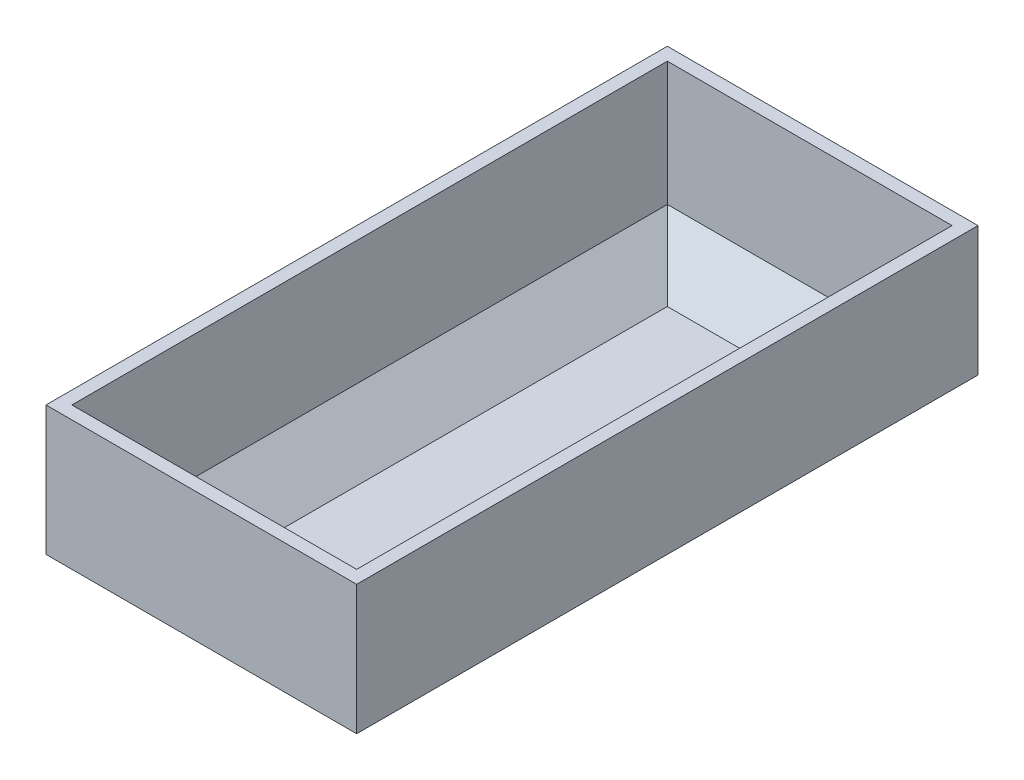
ISO-10303-21;
HEADER;
FILE_DESCRIPTION(('STEP AP214'),'2;1');
FILE_NAME('part.step','',(''),(''),'','','');
FILE_SCHEMA(('AUTOMOTIVE_DESIGN { 1 0 10303 214 1 1 1 1 }'));
ENDSEC;
DATA;
#1=APPLICATION_CONTEXT('core data for automotive mechanical design processes');
#2=APPLICATION_PROTOCOL_DEFINITION('international standard','automotive_design',2000,#1);
#3=PRODUCT_CONTEXT('',#1,'mechanical');
#4=PRODUCT('Part','Part','',(#3));
#5=PRODUCT_RELATED_PRODUCT_CATEGORY('part','',(#4));
#6=PRODUCT_DEFINITION_FORMATION('','',#4);
#7=PRODUCT_DEFINITION_CONTEXT('part definition',#1,'design');
#8=PRODUCT_DEFINITION('design','',#6,#7);
#9=PRODUCT_DEFINITION_SHAPE('','',#8);
#10=(LENGTH_UNIT() NAMED_UNIT(*) SI_UNIT(.MILLI.,.METRE.));
#11=(NAMED_UNIT(*) PLANE_ANGLE_UNIT() SI_UNIT($,.RADIAN.));
#12=(NAMED_UNIT(*) SI_UNIT($,.STERADIAN.) SOLID_ANGLE_UNIT());
#13=UNCERTAINTY_MEASURE_WITH_UNIT(LENGTH_MEASURE(1.E-05),#10,'distance_accuracy_value','');
#14=(GEOMETRIC_REPRESENTATION_CONTEXT(3) GLOBAL_UNCERTAINTY_ASSIGNED_CONTEXT((#13)) GLOBAL_UNIT_ASSIGNED_CONTEXT((#10,
#11,#12)) REPRESENTATION_CONTEXT('',''));
#15=CARTESIAN_POINT('',(0.,0.,0.));
#16=DIRECTION('',(0.,0.,1.));
#17=DIRECTION('',(1.,0.,0.));
#18=AXIS2_PLACEMENT_3D('',#15,#16,#17);
#19=CARTESIAN_POINT('',(-152.4,177.8,304.8));
#20=DIRECTION('',(0.,-1.,0.));
#21=DIRECTION('',(0.,0.,-1.));
#22=AXIS2_PLACEMENT_3D('',#19,#20,#21);
#23=PLANE('',#22);
#24=DIRECTION('',(-1.,0.,0.));
#25=VECTOR('',#24,1.);
#26=CARTESIAN_POINT('',(-152.4,177.8,-304.8));
#27=LINE('',#26,#25);
#28=CARTESIAN_POINT('',(152.4,177.8,-304.8));
#29=VERTEX_POINT('',#28);
#30=CARTESIAN_POINT('',(-152.4,177.8,-304.8));
#31=VERTEX_POINT('',#30);
#32=EDGE_CURVE('E261',#29,#31,#27,.T.);
#33=ORIENTED_EDGE('',*,*,#32,.T.);
#34=DIRECTION('',(0.,0.,-1.));
#35=VECTOR('',#34,1.);
#36=CARTESIAN_POINT('',(-152.4,177.8,304.8));
#37=LINE('',#36,#35);
#38=CARTESIAN_POINT('',(-152.4,177.8,304.8));
#39=VERTEX_POINT('',#38);
#40=EDGE_CURVE('E270',#39,#31,#37,.T.);
#41=ORIENTED_EDGE('',*,*,#40,.F.);
#42=DIRECTION('',(-1.,0.,0.));
#43=VECTOR('',#42,1.);
#44=CARTESIAN_POINT('',(-152.4,177.8,304.8));
#45=LINE('',#44,#43);
#46=CARTESIAN_POINT('',(152.4,177.8,304.8));
#47=VERTEX_POINT('',#46);
#48=EDGE_CURVE('E63',#47,#39,#45,.T.);
#49=ORIENTED_EDGE('',*,*,#48,.F.);
#50=DIRECTION('',(0.,0.,-1.));
#51=VECTOR('',#50,1.);
#52=CARTESIAN_POINT('',(152.4,177.8,304.8));
#53=LINE('',#52,#51);
#54=EDGE_CURVE('E274',#47,#29,#53,.T.);
#55=ORIENTED_EDGE('',*,*,#54,.T.);
#56=EDGE_LOOP('',(#33,#41,#49,#55));
#57=FACE_BOUND('',#56,.T.);
#58=DIRECTION('',(-1.,0.,0.));
#59=VECTOR('',#58,1.);
#60=CARTESIAN_POINT('',(-152.4,177.8,-292.1));
#61=LINE('',#60,#59);
#62=CARTESIAN_POINT('',(139.7,177.8,-292.1));
#63=VERTEX_POINT('',#62);
#64=CARTESIAN_POINT('',(-139.7,177.8,-292.1));
#65=VERTEX_POINT('',#64);
#66=EDGE_CURVE('E166',#63,#65,#61,.T.);
#67=ORIENTED_EDGE('',*,*,#66,.F.);
#68=DIRECTION('',(0.,0.,-1.));
#69=VECTOR('',#68,1.);
#70=CARTESIAN_POINT('',(139.7,177.8,304.8));
#71=LINE('',#70,#69);
#72=CARTESIAN_POINT('',(139.7,177.8,292.1));
#73=VERTEX_POINT('',#72);
#74=EDGE_CURVE('E180',#73,#63,#71,.T.);
#75=ORIENTED_EDGE('',*,*,#74,.F.);
#76=DIRECTION('',(-1.,0.,0.));
#77=VECTOR('',#76,1.);
#78=CARTESIAN_POINT('',(-152.4,177.8,292.1));
#79=LINE('',#78,#77);
#80=CARTESIAN_POINT('',(-139.7,177.8,292.1));
#81=VERTEX_POINT('',#80);
#82=EDGE_CURVE('E54',#73,#81,#79,.T.);
#83=ORIENTED_EDGE('',*,*,#82,.T.);
#84=DIRECTION('',(0.,0.,-1.));
#85=VECTOR('',#84,1.);
#86=CARTESIAN_POINT('',(-139.7,177.8,304.8));
#87=LINE('',#86,#85);
#88=EDGE_CURVE('E176',#81,#65,#87,.T.);
#89=ORIENTED_EDGE('',*,*,#88,.T.);
#90=EDGE_LOOP('',(#67,#75,#83,#89));
#91=FACE_BOUND('',#90,.T.);
#92=ADVANCED_FACE('F38',(#57,#91),#23,.F.);
#93=CARTESIAN_POINT('',(-101.6,0.,304.8));
#94=DIRECTION('',(0.707106781186547,0.707106781186548,0.));
#95=DIRECTION('',(-0.707106781186548,0.707106781186547,0.));
#96=AXIS2_PLACEMENT_3D('',#93,#94,#95);
#97=PLANE('',#96);
#98=DIRECTION('',(0.,0.,-1.));
#99=VECTOR('',#98,1.);
#100=CARTESIAN_POINT('',(-152.4,50.8,304.8));
#101=LINE('',#100,#99);
#102=CARTESIAN_POINT('',(-152.4,50.8,304.8));
#103=VERTEX_POINT('',#102);
#104=CARTESIAN_POINT('',(-152.4,50.8,-304.8));
#105=VERTEX_POINT('',#104);
#106=EDGE_CURVE('E258',#103,#105,#101,.T.);
#107=ORIENTED_EDGE('',*,*,#106,.T.);
#108=DIRECTION('',(0.577350269189625,-0.577350269189625,0.577350269189628));
#109=VECTOR('',#108,1.);
#110=CARTESIAN_POINT('',(84.6666666666669,-186.266666666667,-67.733333333332));
#111=LINE('',#110,#109);
#112=CARTESIAN_POINT('',(-101.6,0.,-254.));
#113=VERTEX_POINT('',#112);
#114=EDGE_CURVE('E81',#105,#113,#111,.T.);
#115=ORIENTED_EDGE('',*,*,#114,.T.);
#116=DIRECTION('',(0.,0.,-1.));
#117=VECTOR('',#116,1.);
#118=CARTESIAN_POINT('',(-101.6,0.,304.8));
#119=LINE('',#118,#117);
#120=CARTESIAN_POINT('',(-101.6,0.,254.));
#121=VERTEX_POINT('',#120);
#122=EDGE_CURVE('E11',#121,#113,#119,.T.);
#123=ORIENTED_EDGE('',*,*,#122,.F.);
#124=DIRECTION('',(-0.577350269189625,0.577350269189625,0.577350269189628));
#125=VECTOR('',#124,1.);
#126=CARTESIAN_POINT('',(-118.533333333333,16.9333333333334,270.933333333333));
#127=LINE('',#126,#125);
#128=EDGE_CURVE('E244',#121,#103,#127,.T.);
#129=ORIENTED_EDGE('',*,*,#128,.T.);
#130=EDGE_LOOP('',(#107,#115,#123,#129));
#131=FACE_BOUND('',#130,.T.);
#132=ADVANCED_FACE('F40',(#131),#97,.F.);
#133=CARTESIAN_POINT('',(-101.6,0.,304.8));
#134=DIRECTION('',(0.,1.,0.));
#135=DIRECTION('',(-1.,0.,0.));
#136=AXIS2_PLACEMENT_3D('',#133,#134,#135);
#137=PLANE('',#136);
#138=ORIENTED_EDGE('',*,*,#122,.T.);
#139=DIRECTION('',(1.,0.,0.));
#140=VECTOR('',#139,1.);
#141=CARTESIAN_POINT('',(-152.4,0.,-254.));
#142=LINE('',#141,#140);
#143=CARTESIAN_POINT('',(101.6,0.,-254.));
#144=VERTEX_POINT('',#143);
#145=EDGE_CURVE('E228',#113,#144,#142,.T.);
#146=ORIENTED_EDGE('',*,*,#145,.T.);
#147=DIRECTION('',(0.,0.,-1.));
#148=VECTOR('',#147,1.);
#149=CARTESIAN_POINT('',(101.6,0.,304.8));
#150=LINE('',#149,#148);
#151=CARTESIAN_POINT('',(101.6,0.,254.));
#152=VERTEX_POINT('',#151);
#153=EDGE_CURVE('E47',#152,#144,#150,.T.);
#154=ORIENTED_EDGE('',*,*,#153,.F.);
#155=DIRECTION('',(1.,0.,0.));
#156=VECTOR('',#155,1.);
#157=CARTESIAN_POINT('',(-152.4,0.,254.));
#158=LINE('',#157,#156);
#159=EDGE_CURVE('E232',#121,#152,#158,.T.);
#160=ORIENTED_EDGE('',*,*,#159,.F.);
#161=EDGE_LOOP('',(#138,#146,#154,#160));
#162=FACE_BOUND('',#161,.T.);
#163=ADVANCED_FACE('F289',(#162),#137,.F.);
#164=CARTESIAN_POINT('',(152.4,50.8,304.8));
#165=DIRECTION('',(-0.707106781186547,0.707106781186548,0.));
#166=DIRECTION('',(-0.707106781186548,-0.707106781186547,0.));
#167=AXIS2_PLACEMENT_3D('',#164,#165,#166);
#168=PLANE('',#167);
#169=ORIENTED_EDGE('',*,*,#153,.T.);
#170=DIRECTION('',(0.577350269189625,0.577350269189625,-0.577350269189628));
#171=VECTOR('',#170,1.);
#172=CARTESIAN_POINT('',(-50.8000000000003,-152.4,-101.599999999999));
#173=LINE('',#172,#171);
#174=CARTESIAN_POINT('',(152.4,50.8,-304.8));
#175=VERTEX_POINT('',#174);
#176=EDGE_CURVE('E227',#144,#175,#173,.T.);
#177=ORIENTED_EDGE('',*,*,#176,.T.);
#178=DIRECTION('',(0.,0.,-1.));
#179=VECTOR('',#178,1.);
#180=CARTESIAN_POINT('',(152.4,50.8,304.8));
#181=LINE('',#180,#179);
#182=CARTESIAN_POINT('',(152.4,50.8,304.8));
#183=VERTEX_POINT('',#182);
#184=EDGE_CURVE('E278',#183,#175,#181,.T.);
#185=ORIENTED_EDGE('',*,*,#184,.F.);
#186=DIRECTION('',(-0.577350269189625,-0.577350269189625,-0.577350269189628));
#187=VECTOR('',#186,1.);
#188=CARTESIAN_POINT('',(152.4,50.8,304.8));
#189=LINE('',#188,#187);
#190=EDGE_CURVE('E88',#183,#152,#189,.T.);
#191=ORIENTED_EDGE('',*,*,#190,.T.);
#192=EDGE_LOOP('',(#169,#177,#185,#191));
#193=FACE_BOUND('',#192,.T.);
#194=ADVANCED_FACE('F285',(#193),#168,.F.);
#195=CARTESIAN_POINT('',(152.4,177.8,304.8));
#196=DIRECTION('',(-1.,0.,0.));
#197=DIRECTION('',(0.,0.,1.));
#198=AXIS2_PLACEMENT_3D('',#195,#196,#197);
#199=PLANE('',#198);
#200=DIRECTION('',(0.,1.,0.));
#201=VECTOR('',#200,1.);
#202=CARTESIAN_POINT('',(152.4,177.8,-304.8));
#203=LINE('',#202,#201);
#204=EDGE_CURVE('E248',#175,#29,#203,.T.);
#205=ORIENTED_EDGE('',*,*,#204,.T.);
#206=ORIENTED_EDGE('',*,*,#54,.F.);
#207=DIRECTION('',(0.,1.,0.));
#208=VECTOR('',#207,1.);
#209=CARTESIAN_POINT('',(152.4,177.8,304.8));
#210=LINE('',#209,#208);
#211=EDGE_CURVE('E249',#183,#47,#210,.T.);
#212=ORIENTED_EDGE('',*,*,#211,.F.);
#213=ORIENTED_EDGE('',*,*,#184,.T.);
#214=EDGE_LOOP('',(#205,#206,#212,#213));
#215=FACE_BOUND('',#214,.T.);
#216=ADVANCED_FACE('F304',(#215),#199,.F.);
#217=CARTESIAN_POINT('',(-152.4,50.8,304.8));
#218=DIRECTION('',(1.,0.,0.));
#219=DIRECTION('',(0.,0.,-1.));
#220=AXIS2_PLACEMENT_3D('',#217,#218,#219);
#221=PLANE('',#220);
#222=DIRECTION('',(0.,-1.,0.));
#223=VECTOR('',#222,1.);
#224=CARTESIAN_POINT('',(-152.4,50.8,-304.8));
#225=LINE('',#224,#223);
#226=EDGE_CURVE('E252',#31,#105,#225,.T.);
#227=ORIENTED_EDGE('',*,*,#226,.T.);
#228=ORIENTED_EDGE('',*,*,#106,.F.);
#229=DIRECTION('',(0.,-1.,0.));
#230=VECTOR('',#229,1.);
#231=CARTESIAN_POINT('',(-152.4,50.8,304.8));
#232=LINE('',#231,#230);
#233=EDGE_CURVE('E255',#39,#103,#232,.T.);
#234=ORIENTED_EDGE('',*,*,#233,.F.);
#235=ORIENTED_EDGE('',*,*,#40,.T.);
#236=EDGE_LOOP('',(#227,#228,#234,#235));
#237=FACE_BOUND('',#236,.T.);
#238=ADVANCED_FACE('F296',(#237),#221,.F.);
#239=CARTESIAN_POINT('',(0.,0.,304.8));
#240=DIRECTION('',(0.,0.,1.));
#241=DIRECTION('',(1.,0.,0.));
#242=AXIS2_PLACEMENT_3D('',#239,#240,#241);
#243=PLANE('',#242);
#244=DIRECTION('',(1.,0.,0.));
#245=VECTOR('',#244,1.);
#246=CARTESIAN_POINT('',(-152.4,50.8,304.8));
#247=LINE('',#246,#245);
#248=EDGE_CURVE('E186',#103,#183,#247,.T.);
#249=ORIENTED_EDGE('',*,*,#248,.T.);
#250=ORIENTED_EDGE('',*,*,#211,.T.);
#251=ORIENTED_EDGE('',*,*,#48,.T.);
#252=ORIENTED_EDGE('',*,*,#233,.T.);
#253=EDGE_LOOP('',(#249,#250,#251,#252));
#254=FACE_BOUND('',#253,.T.);
#255=ADVANCED_FACE('F347',(#254),#243,.T.);
#256=CARTESIAN_POINT('',(0.,0.,-304.8));
#257=DIRECTION('',(0.,0.,1.));
#258=DIRECTION('',(1.,0.,0.));
#259=AXIS2_PLACEMENT_3D('',#256,#257,#258);
#260=PLANE('',#259);
#261=ORIENTED_EDGE('',*,*,#204,.F.);
#262=DIRECTION('',(1.,0.,0.));
#263=VECTOR('',#262,1.);
#264=CARTESIAN_POINT('',(-152.4,50.8,-304.8));
#265=LINE('',#264,#263);
#266=EDGE_CURVE('E224',#105,#175,#265,.T.);
#267=ORIENTED_EDGE('',*,*,#266,.F.);
#268=ORIENTED_EDGE('',*,*,#226,.F.);
#269=ORIENTED_EDGE('',*,*,#32,.F.);
#270=EDGE_LOOP('',(#261,#267,#268,#269));
#271=FACE_BOUND('',#270,.T.);
#272=ADVANCED_FACE('F301',(#271),#260,.F.);
#273=CARTESIAN_POINT('',(-152.4,0.,-254.));
#274=DIRECTION('',(0.,0.707106781186549,0.707106781186546));
#275=DIRECTION('',(0.,-0.707106781186546,0.707106781186549));
#276=AXIS2_PLACEMENT_3D('',#273,#274,#275);
#277=PLANE('',#276);
#278=ORIENTED_EDGE('',*,*,#266,.T.);
#279=ORIENTED_EDGE('',*,*,#176,.F.);
#280=ORIENTED_EDGE('',*,*,#145,.F.);
#281=ORIENTED_EDGE('',*,*,#114,.F.);
#282=EDGE_LOOP('',(#278,#279,#280,#281));
#283=FACE_BOUND('',#282,.T.);
#284=ADVANCED_FACE('F291',(#283),#277,.F.);
#285=CARTESIAN_POINT('',(-152.4,50.8,304.8));
#286=DIRECTION('',(0.,0.707106781186549,-0.707106781186546));
#287=DIRECTION('',(0.,0.707106781186546,0.707106781186549));
#288=AXIS2_PLACEMENT_3D('',#285,#286,#287);
#289=PLANE('',#288);
#290=ORIENTED_EDGE('',*,*,#159,.T.);
#291=ORIENTED_EDGE('',*,*,#190,.F.);
#292=ORIENTED_EDGE('',*,*,#248,.F.);
#293=ORIENTED_EDGE('',*,*,#128,.F.);
#294=EDGE_LOOP('',(#290,#291,#292,#293));
#295=FACE_BOUND('',#294,.T.);
#296=ADVANCED_FACE('F344',(#295),#289,.F.);
#297=CARTESIAN_POINT('',(-92.6197438789308,8.98025612106916,304.8));
#298=DIRECTION('',(0.707106781186547,0.707106781186548,0.));
#299=DIRECTION('',(-0.707106781186548,0.707106781186547,0.));
#300=AXIS2_PLACEMENT_3D('',#297,#298,#299);
#301=PLANE('',#300);
#302=DIRECTION('',(0.,0.,-1.));
#303=VECTOR('',#302,1.);
#304=CARTESIAN_POINT('',(-139.7,56.0605122421383,304.8));
#305=LINE('',#304,#303);
#306=CARTESIAN_POINT('',(-139.7,56.0605122421383,292.1));
#307=VERTEX_POINT('',#306);
#308=CARTESIAN_POINT('',(-139.7,56.0605122421383,-292.1));
#309=VERTEX_POINT('',#308);
#310=EDGE_CURVE('E144',#307,#309,#305,.T.);
#311=ORIENTED_EDGE('',*,*,#310,.F.);
#312=DIRECTION('',(-0.577350269189625,0.577350269189625,0.577350269189628));
#313=VECTOR('',#312,1.);
#314=CARTESIAN_POINT('',(-112.546495919287,28.9070081614256,264.946495919287));
#315=LINE('',#314,#313);
#316=CARTESIAN_POINT('',(-96.3394877578617,12.7,248.739487757861));
#317=VERTEX_POINT('',#316);
#318=EDGE_CURVE('E188',#317,#307,#315,.T.);
#319=ORIENTED_EDGE('',*,*,#318,.F.);
#320=DIRECTION('',(0.,0.,-1.));
#321=VECTOR('',#320,1.);
#322=CARTESIAN_POINT('',(-96.3394877578617,12.7,304.8));
#323=LINE('',#322,#321);
#324=CARTESIAN_POINT('',(-96.3394877578617,12.7,-248.739487757861));
#325=VERTEX_POINT('',#324);
#326=EDGE_CURVE('E146',#317,#325,#323,.T.);
#327=ORIENTED_EDGE('',*,*,#326,.T.);
#328=DIRECTION('',(0.577350269189625,-0.577350269189625,0.577350269189628));
#329=VECTOR('',#328,1.);
#330=CARTESIAN_POINT('',(90.653504080713,-174.292991838575,-61.746495919286));
#331=LINE('',#330,#329);
#332=EDGE_CURVE('E140',#309,#325,#331,.T.);
#333=ORIENTED_EDGE('',*,*,#332,.F.);
#334=EDGE_LOOP('',(#311,#319,#327,#333));
#335=FACE_BOUND('',#334,.T.);
#336=ADVANCED_FACE('F142',(#335),#301,.T.);
#337=CARTESIAN_POINT('',(-101.6,12.7,304.8));
#338=DIRECTION('',(0.,1.,0.));
#339=DIRECTION('',(-1.,0.,0.));
#340=AXIS2_PLACEMENT_3D('',#337,#338,#339);
#341=PLANE('',#340);
#342=ORIENTED_EDGE('',*,*,#326,.F.);
#343=DIRECTION('',(1.,0.,0.));
#344=VECTOR('',#343,1.);
#345=CARTESIAN_POINT('',(-152.4,12.7,248.739487757861));
#346=LINE('',#345,#344);
#347=CARTESIAN_POINT('',(96.3394877578617,12.7,248.739487757861));
#348=VERTEX_POINT('',#347);
#349=EDGE_CURVE('E195',#317,#348,#346,.T.);
#350=ORIENTED_EDGE('',*,*,#349,.T.);
#351=DIRECTION('',(0.,0.,-1.));
#352=VECTOR('',#351,1.);
#353=CARTESIAN_POINT('',(96.3394877578617,12.7,304.8));
#354=LINE('',#353,#352);
#355=CARTESIAN_POINT('',(96.3394877578617,12.7,-248.739487757861));
#356=VERTEX_POINT('',#355);
#357=EDGE_CURVE('E187',#348,#356,#354,.T.);
#358=ORIENTED_EDGE('',*,*,#357,.T.);
#359=DIRECTION('',(1.,0.,0.));
#360=VECTOR('',#359,1.);
#361=CARTESIAN_POINT('',(-101.6,12.7,-248.739487757862));
#362=LINE('',#361,#360);
#363=EDGE_CURVE('E160',#325,#356,#362,.T.);
#364=ORIENTED_EDGE('',*,*,#363,.F.);
#365=EDGE_LOOP('',(#342,#350,#358,#364));
#366=FACE_BOUND('',#365,.T.);
#367=ADVANCED_FACE('F318',(#366),#341,.T.);
#368=CARTESIAN_POINT('',(143.419743878931,59.7802561210692,304.8));
#369=DIRECTION('',(-0.707106781186547,0.707106781186548,0.));
#370=DIRECTION('',(-0.707106781186548,-0.707106781186547,0.));
#371=AXIS2_PLACEMENT_3D('',#368,#369,#370);
#372=PLANE('',#371);
#373=ORIENTED_EDGE('',*,*,#357,.F.);
#374=DIRECTION('',(-0.577350269189625,-0.577350269189625,-0.577350269189628));
#375=VECTOR('',#374,1.);
#376=CARTESIAN_POINT('',(146.413162585954,62.7736748280922,298.813162585954));
#377=LINE('',#376,#375);
#378=CARTESIAN_POINT('',(139.7,56.0605122421383,292.1));
#379=VERTEX_POINT('',#378);
#380=EDGE_CURVE('E150',#379,#348,#377,.T.);
#381=ORIENTED_EDGE('',*,*,#380,.F.);
#382=DIRECTION('',(0.,0.,-1.));
#383=VECTOR('',#382,1.);
#384=CARTESIAN_POINT('',(139.7,56.0605122421383,304.8));
#385=LINE('',#384,#383);
#386=CARTESIAN_POINT('',(139.7,56.0605122421383,-292.1));
#387=VERTEX_POINT('',#386);
#388=EDGE_CURVE('E199',#379,#387,#385,.T.);
#389=ORIENTED_EDGE('',*,*,#388,.T.);
#390=DIRECTION('',(0.577350269189625,0.577350269189625,-0.577350269189628));
#391=VECTOR('',#390,1.);
#392=CARTESIAN_POINT('',(-56.7868374140464,-140.426325171908,-95.6131625859527));
#393=LINE('',#392,#391);
#394=EDGE_CURVE('E151',#356,#387,#393,.T.);
#395=ORIENTED_EDGE('',*,*,#394,.F.);
#396=EDGE_LOOP('',(#373,#381,#389,#395));
#397=FACE_BOUND('',#396,.T.);
#398=ADVANCED_FACE('F320',(#397),#372,.T.);
#399=CARTESIAN_POINT('',(139.7,177.8,304.8));
#400=DIRECTION('',(-1.,0.,0.));
#401=DIRECTION('',(0.,0.,1.));
#402=AXIS2_PLACEMENT_3D('',#399,#400,#401);
#403=PLANE('',#402);
#404=DIRECTION('',(0.,1.,0.));
#405=VECTOR('',#404,1.);
#406=CARTESIAN_POINT('',(139.7,177.8,-292.1));
#407=LINE('',#406,#405);
#408=EDGE_CURVE('E192',#387,#63,#407,.T.);
#409=ORIENTED_EDGE('',*,*,#408,.F.);
#410=ORIENTED_EDGE('',*,*,#388,.F.);
#411=DIRECTION('',(0.,1.,0.));
#412=VECTOR('',#411,1.);
#413=CARTESIAN_POINT('',(139.7,177.8,292.1));
#414=LINE('',#413,#412);
#415=EDGE_CURVE('E170',#379,#73,#414,.T.);
#416=ORIENTED_EDGE('',*,*,#415,.T.);
#417=ORIENTED_EDGE('',*,*,#74,.T.);
#418=EDGE_LOOP('',(#409,#410,#416,#417));
#419=FACE_BOUND('',#418,.T.);
#420=ADVANCED_FACE('F323',(#419),#403,.T.);
#421=CARTESIAN_POINT('',(-139.7,50.8,304.8));
#422=DIRECTION('',(1.,0.,0.));
#423=DIRECTION('',(0.,0.,-1.));
#424=AXIS2_PLACEMENT_3D('',#421,#422,#423);
#425=PLANE('',#424);
#426=DIRECTION('',(0.,-1.,0.));
#427=VECTOR('',#426,1.);
#428=CARTESIAN_POINT('',(-139.7,50.8,-292.1));
#429=LINE('',#428,#427);
#430=EDGE_CURVE('E163',#65,#309,#429,.T.);
#431=ORIENTED_EDGE('',*,*,#430,.F.);
#432=ORIENTED_EDGE('',*,*,#88,.F.);
#433=DIRECTION('',(0.,-1.,0.));
#434=VECTOR('',#433,1.);
#435=CARTESIAN_POINT('',(-139.7,50.8,292.1));
#436=LINE('',#435,#434);
#437=EDGE_CURVE('E174',#81,#307,#436,.T.);
#438=ORIENTED_EDGE('',*,*,#437,.T.);
#439=ORIENTED_EDGE('',*,*,#310,.T.);
#440=EDGE_LOOP('',(#431,#432,#438,#439));
#441=FACE_BOUND('',#440,.T.);
#442=ADVANCED_FACE('F173',(#441),#425,.T.);
#443=CARTESIAN_POINT('',(0.,0.,292.1));
#444=DIRECTION('',(0.,0.,1.));
#445=DIRECTION('',(1.,0.,0.));
#446=AXIS2_PLACEMENT_3D('',#443,#444,#445);
#447=PLANE('',#446);
#448=DIRECTION('',(1.,0.,0.));
#449=VECTOR('',#448,1.);
#450=CARTESIAN_POINT('',(-152.4,56.0605122421383,292.1));
#451=LINE('',#450,#449);
#452=EDGE_CURVE('E202',#307,#379,#451,.T.);
#453=ORIENTED_EDGE('',*,*,#452,.F.);
#454=ORIENTED_EDGE('',*,*,#437,.F.);
#455=ORIENTED_EDGE('',*,*,#82,.F.);
#456=ORIENTED_EDGE('',*,*,#415,.F.);
#457=EDGE_LOOP('',(#453,#454,#455,#456));
#458=FACE_BOUND('',#457,.T.);
#459=ADVANCED_FACE('F311',(#458),#447,.F.);
#460=CARTESIAN_POINT('',(0.,0.,-292.1));
#461=DIRECTION('',(0.,0.,1.));
#462=DIRECTION('',(1.,0.,0.));
#463=AXIS2_PLACEMENT_3D('',#460,#461,#462);
#464=PLANE('',#463);
#465=ORIENTED_EDGE('',*,*,#408,.T.);
#466=ORIENTED_EDGE('',*,*,#66,.T.);
#467=ORIENTED_EDGE('',*,*,#430,.T.);
#468=DIRECTION('',(1.,0.,0.));
#469=VECTOR('',#468,1.);
#470=CARTESIAN_POINT('',(-152.4,56.0605122421383,-292.1));
#471=LINE('',#470,#469);
#472=EDGE_CURVE('E154',#309,#387,#471,.T.);
#473=ORIENTED_EDGE('',*,*,#472,.T.);
#474=EDGE_LOOP('',(#465,#466,#467,#473));
#475=FACE_BOUND('',#474,.T.);
#476=ADVANCED_FACE('F164',(#475),#464,.T.);
#477=CARTESIAN_POINT('',(-152.4,8.98025612106919,-245.019743878931));
#478=DIRECTION('',(0.,0.707106781186549,0.707106781186546));
#479=DIRECTION('',(0.,-0.707106781186546,0.707106781186549));
#480=AXIS2_PLACEMENT_3D('',#477,#478,#479);
#481=PLANE('',#480);
#482=ORIENTED_EDGE('',*,*,#472,.F.);
#483=ORIENTED_EDGE('',*,*,#332,.T.);
#484=ORIENTED_EDGE('',*,*,#363,.T.);
#485=ORIENTED_EDGE('',*,*,#394,.T.);
#486=EDGE_LOOP('',(#482,#483,#484,#485));
#487=FACE_BOUND('',#486,.T.);
#488=ADVANCED_FACE('F156',(#487),#481,.T.);
#489=CARTESIAN_POINT('',(-152.4,59.7802561210692,295.819743878931));
#490=DIRECTION('',(0.,0.707106781186549,-0.707106781186546));
#491=DIRECTION('',(0.,0.707106781186546,0.707106781186549));
#492=AXIS2_PLACEMENT_3D('',#489,#490,#491);
#493=PLANE('',#492);
#494=ORIENTED_EDGE('',*,*,#349,.F.);
#495=ORIENTED_EDGE('',*,*,#318,.T.);
#496=ORIENTED_EDGE('',*,*,#452,.T.);
#497=ORIENTED_EDGE('',*,*,#380,.T.);
#498=EDGE_LOOP('',(#494,#495,#496,#497));
#499=FACE_BOUND('',#498,.T.);
#500=ADVANCED_FACE('F315',(#499),#493,.T.);
#501=CLOSED_SHELL('',(#92,#132,#163,#194,#216,#238,#255,#272,#284,#296,#336,#367,#398,#420,#442,
#459,#476,#488,#500));
#502=MANIFOLD_SOLID_BREP('B2',#501);
#503=ADVANCED_BREP_SHAPE_REPRESENTATION('',(#18,#502),#14);
#504=SHAPE_DEFINITION_REPRESENTATION(#9,#503);
ENDSEC;
END-ISO-10303-21;
